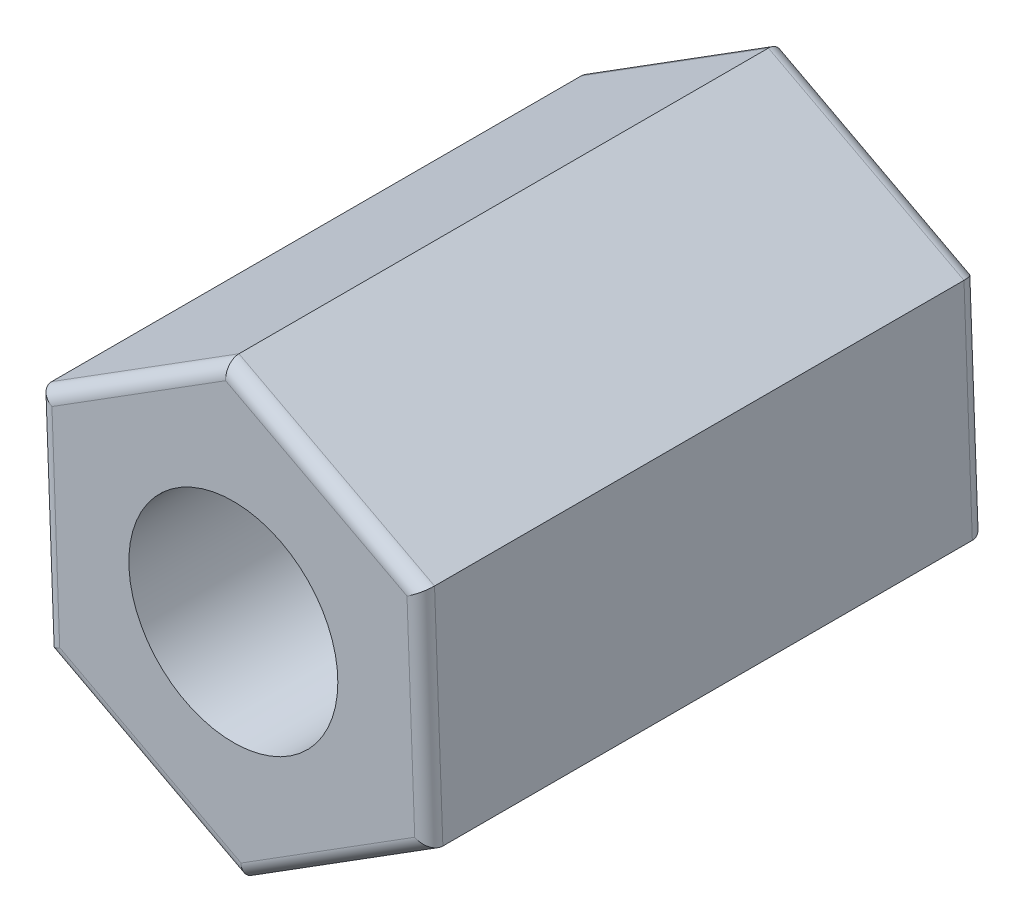
ISO-10303-21;
HEADER;
FILE_DESCRIPTION(('STEP AP214'),'2;1');
FILE_NAME('part.step','',(''),(''),'','','');
FILE_SCHEMA(('AUTOMOTIVE_DESIGN { 1 0 10303 214 1 1 1 1 }'));
ENDSEC;
DATA;
#1=APPLICATION_CONTEXT('core data for automotive mechanical design processes');
#2=APPLICATION_PROTOCOL_DEFINITION('international standard','automotive_design',2000,#1);
#3=PRODUCT_CONTEXT('',#1,'mechanical');
#4=PRODUCT('Part','Part','',(#3));
#5=PRODUCT_RELATED_PRODUCT_CATEGORY('part','',(#4));
#6=PRODUCT_DEFINITION_FORMATION('','',#4);
#7=PRODUCT_DEFINITION_CONTEXT('part definition',#1,'design');
#8=PRODUCT_DEFINITION('design','',#6,#7);
#9=PRODUCT_DEFINITION_SHAPE('','',#8);
#10=(LENGTH_UNIT() NAMED_UNIT(*) SI_UNIT(.MILLI.,.METRE.));
#11=(NAMED_UNIT(*) PLANE_ANGLE_UNIT() SI_UNIT($,.RADIAN.));
#12=(NAMED_UNIT(*) SI_UNIT($,.STERADIAN.) SOLID_ANGLE_UNIT());
#13=UNCERTAINTY_MEASURE_WITH_UNIT(LENGTH_MEASURE(1.E-05),#10,'distance_accuracy_value','');
#14=(GEOMETRIC_REPRESENTATION_CONTEXT(3) GLOBAL_UNCERTAINTY_ASSIGNED_CONTEXT((#13)) GLOBAL_UNIT_ASSIGNED_CONTEXT((#10,
#11,#12)) REPRESENTATION_CONTEXT('',''));
#15=CARTESIAN_POINT('',(0.,0.,0.));
#16=DIRECTION('',(0.,0.,1.));
#17=DIRECTION('',(1.,0.,0.));
#18=AXIS2_PLACEMENT_3D('',#15,#16,#17);
#19=CARTESIAN_POINT('',(1.19089394216838,2.25483294691794,7.8));
#20=DIRECTION('',(0.884248214477624,-0.467017232222896,0.));
#21=DIRECTION('',(0.467017232222896,0.884248214477624,0.));
#22=AXIS2_PLACEMENT_3D('',#19,#20,#21);
#23=CYLINDRICAL_SURFACE('',#22,0.2);
#24=CARTESIAN_POINT('',(-0.110934466712332,2.94239588500515,7.8));
#25=DIRECTION('',(0.999290033100101,0.0376753201286878,0.));
#26=DIRECTION('',(-0.0376753201286876,0.999290033100101,0.));
#27=AXIS2_PLACEMENT_3D('',#24,#25,#26);
#28=ELLIPSE('',#27,0.23094010767585,0.2);
#29=CARTESIAN_POINT('',(-0.110934466712331,2.94239588500515,8.));
#30=VERTEX_POINT('',#29);
#31=CARTESIAN_POINT('',(-0.119635209199572,3.17317203284869,7.8));
#32=VERTEX_POINT('',#31);
#33=EDGE_CURVE('E11',#30,#32,#28,.F.);
#34=ORIENTED_EDGE('',*,*,#33,.F.);
#35=DIRECTION('',(-0.884248214477624,0.467017232222896,0.));
#36=VECTOR('',#35,1.);
#37=CARTESIAN_POINT('',(1.19089394216838,2.25483294691794,8.));
#38=LINE('',#37,#36);
#39=CARTESIAN_POINT('',(2.4927223510491,1.56727000883072,8.));
#40=VERTEX_POINT('',#39);
#41=EDGE_CURVE('E191',#40,#30,#38,.T.);
#42=ORIENTED_EDGE('',*,*,#41,.F.);
#43=CARTESIAN_POINT('',(2.4927223510491,1.56727000883072,7.8));
#44=DIRECTION('',(0.532272800877204,-0.846572894348937,0.));
#45=DIRECTION('',(0.846572894348937,0.532272800877205,0.));
#46=AXIS2_PLACEMENT_3D('',#43,#44,#45);
#47=ELLIPSE('',#46,0.23094010767585,0.2);
#48=CARTESIAN_POINT('',(2.6882299864255,1.69019314677823,7.8));
#49=VERTEX_POINT('',#48);
#50=EDGE_CURVE('E41',#40,#49,#47,.F.);
#51=ORIENTED_EDGE('',*,*,#50,.T.);
#52=DIRECTION('',(-0.884248214477624,0.467017232222896,0.));
#53=VECTOR('',#52,1.);
#54=CARTESIAN_POINT('',(1.28429738861296,2.43168258981346,7.8));
#55=LINE('',#54,#53);
#56=EDGE_CURVE('E223',#32,#49,#55,.F.);
#57=ORIENTED_EDGE('',*,*,#56,.F.);
#58=EDGE_LOOP('',(#34,#42,#51,#57));
#59=FACE_BOUND('',#58,.T.);
#60=ADVANCED_FACE('F34',(#59),#23,.T.);
#61=CARTESIAN_POINT('',(2.54818958440526,0.0960720663281503,7.8));
#62=DIRECTION('',(0.0376753201286864,-0.999290033100101,0.));
#63=DIRECTION('',(0.999290033100101,0.0376753201286864,0.));
#64=AXIS2_PLACEMENT_3D('',#61,#62,#63);
#65=CYLINDRICAL_SURFACE('',#64,0.2);
#66=ORIENTED_EDGE('',*,*,#50,.F.);
#67=DIRECTION('',(-0.0376753201286864,0.999290033100101,0.));
#68=VECTOR('',#67,1.);
#69=CARTESIAN_POINT('',(2.54818958440526,0.0960720663281503,8.));
#70=LINE('',#69,#68);
#71=CARTESIAN_POINT('',(2.60365681776142,-1.37512587617442,8.));
#72=VERTEX_POINT('',#71);
#73=EDGE_CURVE('E194',#72,#40,#70,.T.);
#74=ORIENTED_EDGE('',*,*,#73,.F.);
#75=CARTESIAN_POINT('',(2.60365681776142,-1.37512587617442,7.8));
#76=DIRECTION('',(-0.467017232222896,-0.884248214477624,0.));
#77=DIRECTION('',(0.884248214477624,-0.467017232222896,0.));
#78=AXIS2_PLACEMENT_3D('',#75,#76,#77);
#79=ELLIPSE('',#78,0.23094010767585,0.2);
#80=CARTESIAN_POINT('',(2.80786519562506,-1.48297888607045,7.8));
#81=VERTEX_POINT('',#80);
#82=EDGE_CURVE('E55',#72,#81,#79,.F.);
#83=ORIENTED_EDGE('',*,*,#82,.T.);
#84=DIRECTION('',(-0.0376753201286864,0.999290033100101,0.));
#85=VECTOR('',#84,1.);
#86=CARTESIAN_POINT('',(2.74804759102528,0.103607130353888,7.8));
#87=LINE('',#86,#85);
#88=EDGE_CURVE('E221',#49,#81,#87,.F.);
#89=ORIENTED_EDGE('',*,*,#88,.F.);
#90=EDGE_LOOP('',(#66,#74,#83,#89));
#91=FACE_BOUND('',#90,.T.);
#92=ADVANCED_FACE('F282',(#91),#65,.T.);
#93=CARTESIAN_POINT('',(1.35729564223687,-2.15876088058979,7.8));
#94=DIRECTION('',(-0.846572894348936,-0.532272800877206,0.));
#95=DIRECTION('',(0.532272800877206,-0.846572894348936,0.));
#96=AXIS2_PLACEMENT_3D('',#93,#94,#95);
#97=CYLINDRICAL_SURFACE('',#96,0.2);
#98=ORIENTED_EDGE('',*,*,#82,.F.);
#99=DIRECTION('',(0.846572894348936,0.532272800877206,0.));
#100=VECTOR('',#99,1.);
#101=CARTESIAN_POINT('',(1.35729564223687,-2.15876088058979,8.));
#102=LINE('',#101,#100);
#103=CARTESIAN_POINT('',(0.110934466712327,-2.94239588500515,8.));
#104=VERTEX_POINT('',#103);
#105=EDGE_CURVE('E197',#104,#72,#102,.T.);
#106=ORIENTED_EDGE('',*,*,#105,.F.);
#107=CARTESIAN_POINT('',(0.110934466712327,-2.94239588500515,7.8));
#108=DIRECTION('',(-0.999290033100101,-0.0376753201286868,0.));
#109=DIRECTION('',(0.0376753201286868,-0.999290033100101,0.));
#110=AXIS2_PLACEMENT_3D('',#107,#108,#109);
#111=ELLIPSE('',#110,0.23094010767585,0.2);
#112=CARTESIAN_POINT('',(0.119635209199567,-3.17317203284869,7.8));
#113=VERTEX_POINT('',#112);
#114=EDGE_CURVE('E229',#104,#113,#111,.F.);
#115=ORIENTED_EDGE('',*,*,#114,.T.);
#116=DIRECTION('',(0.846572894348936,0.532272800877206,0.));
#117=VECTOR('',#116,1.);
#118=CARTESIAN_POINT('',(1.46375020241231,-2.32807545945957,7.8));
#119=LINE('',#118,#117);
#120=EDGE_CURVE('E218',#81,#113,#119,.F.);
#121=ORIENTED_EDGE('',*,*,#120,.F.);
#122=EDGE_LOOP('',(#98,#106,#115,#121));
#123=FACE_BOUND('',#122,.T.);
#124=ADVANCED_FACE('F234',(#123),#97,.T.);
#125=CARTESIAN_POINT('',(-1.19089394216839,-2.25483294691794,7.8));
#126=DIRECTION('',(-0.884248214477623,0.467017232222898,0.));
#127=DIRECTION('',(-0.467017232222898,-0.884248214477623,0.));
#128=AXIS2_PLACEMENT_3D('',#125,#126,#127);
#129=CYLINDRICAL_SURFACE('',#128,0.2);
#130=ORIENTED_EDGE('',*,*,#114,.F.);
#131=DIRECTION('',(0.884248214477623,-0.467017232222898,0.));
#132=VECTOR('',#131,1.);
#133=CARTESIAN_POINT('',(-1.19089394216839,-2.25483294691794,8.));
#134=LINE('',#133,#132);
#135=CARTESIAN_POINT('',(-2.49272235104909,-1.56727000883072,8.));
#136=VERTEX_POINT('',#135);
#137=EDGE_CURVE('E200',#136,#104,#134,.T.);
#138=ORIENTED_EDGE('',*,*,#137,.F.);
#139=CARTESIAN_POINT('',(-2.49272235104909,-1.56727000883072,7.8));
#140=DIRECTION('',(-0.532272800877204,0.846572894348937,0.));
#141=DIRECTION('',(-0.846572894348937,-0.532272800877204,0.));
#142=AXIS2_PLACEMENT_3D('',#139,#140,#141);
#143=ELLIPSE('',#142,0.23094010767585,0.2);
#144=CARTESIAN_POINT('',(-2.68822998642549,-1.69019314677823,7.8));
#145=VERTEX_POINT('',#144);
#146=EDGE_CURVE('E227',#136,#145,#143,.F.);
#147=ORIENTED_EDGE('',*,*,#146,.T.);
#148=DIRECTION('',(0.884248214477623,-0.467017232222898,0.));
#149=VECTOR('',#148,1.);
#150=CARTESIAN_POINT('',(-1.28429738861297,-2.43168258981346,7.8));
#151=LINE('',#150,#149);
#152=EDGE_CURVE('E215',#113,#145,#151,.F.);
#153=ORIENTED_EDGE('',*,*,#152,.F.);
#154=EDGE_LOOP('',(#130,#138,#147,#153));
#155=FACE_BOUND('',#154,.T.);
#156=ADVANCED_FACE('F244',(#155),#129,.T.);
#157=CARTESIAN_POINT('',(-2.54818958440525,-0.0960720663281535,7.8));
#158=DIRECTION('',(-0.0376753201286877,0.999290033100101,0.));
#159=DIRECTION('',(-0.999290033100101,-0.0376753201286877,0.));
#160=AXIS2_PLACEMENT_3D('',#157,#158,#159);
#161=CYLINDRICAL_SURFACE('',#160,0.2);
#162=ORIENTED_EDGE('',*,*,#146,.F.);
#163=DIRECTION('',(0.0376753201286877,-0.999290033100101,0.));
#164=VECTOR('',#163,1.);
#165=CARTESIAN_POINT('',(-2.54818958440525,-0.0960720663281535,8.));
#166=LINE('',#165,#164);
#167=CARTESIAN_POINT('',(-2.60365681776142,1.37512587617442,8.));
#168=VERTEX_POINT('',#167);
#169=EDGE_CURVE('E203',#168,#136,#166,.T.);
#170=ORIENTED_EDGE('',*,*,#169,.F.);
#171=CARTESIAN_POINT('',(-2.60365681776142,1.37512587617442,7.8));
#172=DIRECTION('',(0.467017232222896,0.884248214477624,0.));
#173=DIRECTION('',(-0.884248214477624,0.467017232222895,0.));
#174=AXIS2_PLACEMENT_3D('',#171,#172,#173);
#175=ELLIPSE('',#174,0.23094010767585,0.2);
#176=CARTESIAN_POINT('',(-2.80786519562506,1.48297888607046,7.8));
#177=VERTEX_POINT('',#176);
#178=EDGE_CURVE('E225',#168,#177,#175,.F.);
#179=ORIENTED_EDGE('',*,*,#178,.T.);
#180=DIRECTION('',(0.0376753201286877,-0.999290033100101,0.));
#181=VECTOR('',#180,1.);
#182=CARTESIAN_POINT('',(-2.74804759102527,-0.103607130353891,7.8));
#183=LINE('',#182,#181);
#184=EDGE_CURVE('E212',#145,#177,#183,.F.);
#185=ORIENTED_EDGE('',*,*,#184,.F.);
#186=EDGE_LOOP('',(#162,#170,#179,#185));
#187=FACE_BOUND('',#186,.T.);
#188=ADVANCED_FACE('F311',(#187),#161,.T.);
#189=CARTESIAN_POINT('',(-1.35729564223687,2.15876088058979,7.8));
#190=DIRECTION('',(0.846572894348936,0.532272800877206,0.));
#191=DIRECTION('',(-0.532272800877206,0.846572894348936,0.));
#192=AXIS2_PLACEMENT_3D('',#189,#190,#191);
#193=CYLINDRICAL_SURFACE('',#192,0.2);
#194=DIRECTION('',(-0.846572894348936,-0.532272800877206,0.));
#195=VECTOR('',#194,1.);
#196=CARTESIAN_POINT('',(-1.35729564223687,2.15876088058979,8.));
#197=LINE('',#196,#195);
#198=EDGE_CURVE('E206',#30,#168,#197,.T.);
#199=ORIENTED_EDGE('',*,*,#198,.F.);
#200=ORIENTED_EDGE('',*,*,#33,.T.);
#201=DIRECTION('',(-0.846572894348936,-0.532272800877206,0.));
#202=VECTOR('',#201,1.);
#203=CARTESIAN_POINT('',(-1.46375020241232,2.32807545945957,7.8));
#204=LINE('',#203,#202);
#205=EDGE_CURVE('E209',#177,#32,#204,.F.);
#206=ORIENTED_EDGE('',*,*,#205,.F.);
#207=ORIENTED_EDGE('',*,*,#178,.F.);
#208=EDGE_LOOP('',(#199,#200,#206,#207));
#209=FACE_BOUND('',#208,.T.);
#210=ADVANCED_FACE('F289',(#209),#193,.T.);
#211=CARTESIAN_POINT('',(-2.54818958440525,-0.0960720663281535,0.2));
#212=DIRECTION('',(-0.0376753201286877,0.999290033100101,0.));
#213=DIRECTION('',(-0.999290033100101,-0.0376753201286877,0.));
#214=AXIS2_PLACEMENT_3D('',#211,#212,#213);
#215=CYLINDRICAL_SURFACE('',#214,0.2);
#216=CARTESIAN_POINT('',(-2.60365681776142,1.37512587617442,0.2));
#217=DIRECTION('',(0.467017232222896,0.884248214477624,0.));
#218=DIRECTION('',(0.884248214477624,-0.467017232222895,0.));
#219=AXIS2_PLACEMENT_3D('',#216,#217,#218);
#220=ELLIPSE('',#219,0.23094010767585,0.2);
#221=CARTESIAN_POINT('',(-2.60365681776142,1.37512587617442,0.));
#222=VERTEX_POINT('',#221);
#223=CARTESIAN_POINT('',(-2.80786519562506,1.48297888607046,0.200000000000001));
#224=VERTEX_POINT('',#223);
#225=EDGE_CURVE('E134',#222,#224,#220,.T.);
#226=ORIENTED_EDGE('',*,*,#225,.F.);
#227=DIRECTION('',(-0.0376753201286877,0.999290033100101,0.));
#228=VECTOR('',#227,1.);
#229=CARTESIAN_POINT('',(-2.54818958440525,-0.0960720663281535,0.));
#230=LINE('',#229,#228);
#231=CARTESIAN_POINT('',(-2.49272235104909,-1.56727000883072,0.));
#232=VERTEX_POINT('',#231);
#233=EDGE_CURVE('E143',#232,#222,#230,.T.);
#234=ORIENTED_EDGE('',*,*,#233,.F.);
#235=CARTESIAN_POINT('',(-2.49272235104909,-1.56727000883072,0.2));
#236=DIRECTION('',(-0.532272800877204,0.846572894348937,0.));
#237=DIRECTION('',(0.846572894348937,0.532272800877204,0.));
#238=AXIS2_PLACEMENT_3D('',#235,#236,#237);
#239=ELLIPSE('',#238,0.23094010767585,0.2);
#240=CARTESIAN_POINT('',(-2.68822998642549,-1.69019314677823,0.200000000000001));
#241=VERTEX_POINT('',#240);
#242=EDGE_CURVE('E123',#232,#241,#239,.T.);
#243=ORIENTED_EDGE('',*,*,#242,.T.);
#244=DIRECTION('',(-0.0376753201286877,0.999290033100101,0.));
#245=VECTOR('',#244,1.);
#246=CARTESIAN_POINT('',(-2.80786519562506,1.48297888607046,0.2));
#247=LINE('',#246,#245);
#248=EDGE_CURVE('E178',#224,#241,#247,.F.);
#249=ORIENTED_EDGE('',*,*,#248,.F.);
#250=EDGE_LOOP('',(#226,#234,#243,#249));
#251=FACE_BOUND('',#250,.T.);
#252=ADVANCED_FACE('F148',(#251),#215,.T.);
#253=CARTESIAN_POINT('',(-1.19089394216839,-2.25483294691794,0.2));
#254=DIRECTION('',(-0.884248214477623,0.467017232222898,0.));
#255=DIRECTION('',(-0.467017232222898,-0.884248214477623,0.));
#256=AXIS2_PLACEMENT_3D('',#253,#254,#255);
#257=CYLINDRICAL_SURFACE('',#256,0.2);
#258=ORIENTED_EDGE('',*,*,#242,.F.);
#259=DIRECTION('',(-0.884248214477623,0.467017232222898,0.));
#260=VECTOR('',#259,1.);
#261=CARTESIAN_POINT('',(-1.19089394216839,-2.25483294691794,0.));
#262=LINE('',#261,#260);
#263=CARTESIAN_POINT('',(0.110934466712326,-2.94239588500515,0.));
#264=VERTEX_POINT('',#263);
#265=EDGE_CURVE('E127',#264,#232,#262,.T.);
#266=ORIENTED_EDGE('',*,*,#265,.F.);
#267=CARTESIAN_POINT('',(0.110934466712326,-2.94239588500515,0.2));
#268=DIRECTION('',(-0.999290033100101,-0.0376753201286868,0.));
#269=DIRECTION('',(-0.0376753201286868,0.999290033100101,0.));
#270=AXIS2_PLACEMENT_3D('',#267,#268,#269);
#271=ELLIPSE('',#270,0.23094010767585,0.2);
#272=CARTESIAN_POINT('',(0.119635209199567,-3.17317203284869,0.200000000000001));
#273=VERTEX_POINT('',#272);
#274=EDGE_CURVE('E135',#264,#273,#271,.T.);
#275=ORIENTED_EDGE('',*,*,#274,.T.);
#276=DIRECTION('',(-0.884248214477623,0.467017232222898,0.));
#277=VECTOR('',#276,1.);
#278=CARTESIAN_POINT('',(-2.68822998642549,-1.69019314677823,0.2));
#279=LINE('',#278,#277);
#280=EDGE_CURVE('E129',#241,#273,#279,.F.);
#281=ORIENTED_EDGE('',*,*,#280,.F.);
#282=EDGE_LOOP('',(#258,#266,#275,#281));
#283=FACE_BOUND('',#282,.T.);
#284=ADVANCED_FACE('F125',(#283),#257,.T.);
#285=CARTESIAN_POINT('',(1.35729564223687,-2.15876088058979,0.2));
#286=DIRECTION('',(-0.846572894348936,-0.532272800877206,0.));
#287=DIRECTION('',(0.532272800877206,-0.846572894348936,0.));
#288=AXIS2_PLACEMENT_3D('',#285,#286,#287);
#289=CYLINDRICAL_SURFACE('',#288,0.2);
#290=ORIENTED_EDGE('',*,*,#274,.F.);
#291=DIRECTION('',(-0.846572894348936,-0.532272800877206,0.));
#292=VECTOR('',#291,1.);
#293=CARTESIAN_POINT('',(1.35729564223687,-2.15876088058979,0.));
#294=LINE('',#293,#292);
#295=CARTESIAN_POINT('',(2.60365681776142,-1.37512587617442,0.));
#296=VERTEX_POINT('',#295);
#297=EDGE_CURVE('E146',#296,#264,#294,.T.);
#298=ORIENTED_EDGE('',*,*,#297,.F.);
#299=CARTESIAN_POINT('',(2.60365681776142,-1.37512587617442,0.2));
#300=DIRECTION('',(-0.467017232222896,-0.884248214477624,0.));
#301=DIRECTION('',(-0.884248214477624,0.467017232222896,0.));
#302=AXIS2_PLACEMENT_3D('',#299,#300,#301);
#303=ELLIPSE('',#302,0.23094010767585,0.2);
#304=CARTESIAN_POINT('',(2.80786519562506,-1.48297888607045,0.200000000000001));
#305=VERTEX_POINT('',#304);
#306=EDGE_CURVE('E186',#296,#305,#303,.T.);
#307=ORIENTED_EDGE('',*,*,#306,.T.);
#308=DIRECTION('',(-0.846572894348936,-0.532272800877206,0.));
#309=VECTOR('',#308,1.);
#310=CARTESIAN_POINT('',(0.119635209199567,-3.17317203284869,0.2));
#311=LINE('',#310,#309);
#312=EDGE_CURVE('E174',#273,#305,#311,.F.);
#313=ORIENTED_EDGE('',*,*,#312,.F.);
#314=EDGE_LOOP('',(#290,#298,#307,#313));
#315=FACE_BOUND('',#314,.T.);
#316=ADVANCED_FACE('F417',(#315),#289,.T.);
#317=CARTESIAN_POINT('',(2.54818958440526,0.0960720663281503,0.2));
#318=DIRECTION('',(0.0376753201286864,-0.999290033100101,0.));
#319=DIRECTION('',(0.999290033100101,0.0376753201286864,0.));
#320=AXIS2_PLACEMENT_3D('',#317,#318,#319);
#321=CYLINDRICAL_SURFACE('',#320,0.2);
#322=ORIENTED_EDGE('',*,*,#306,.F.);
#323=DIRECTION('',(0.0376753201286864,-0.999290033100101,0.));
#324=VECTOR('',#323,1.);
#325=CARTESIAN_POINT('',(2.54818958440526,0.0960720663281503,0.));
#326=LINE('',#325,#324);
#327=CARTESIAN_POINT('',(2.4927223510491,1.56727000883072,0.));
#328=VERTEX_POINT('',#327);
#329=EDGE_CURVE('E158',#328,#296,#326,.T.);
#330=ORIENTED_EDGE('',*,*,#329,.F.);
#331=CARTESIAN_POINT('',(2.4927223510491,1.56727000883072,0.2));
#332=DIRECTION('',(0.532272800877204,-0.846572894348937,0.));
#333=DIRECTION('',(-0.846572894348937,-0.532272800877205,0.));
#334=AXIS2_PLACEMENT_3D('',#331,#332,#333);
#335=ELLIPSE('',#334,0.23094010767585,0.2);
#336=CARTESIAN_POINT('',(2.6882299864255,1.69019314677823,0.200000000000001));
#337=VERTEX_POINT('',#336);
#338=EDGE_CURVE('E183',#328,#337,#335,.T.);
#339=ORIENTED_EDGE('',*,*,#338,.T.);
#340=DIRECTION('',(0.0376753201286864,-0.999290033100101,0.));
#341=VECTOR('',#340,1.);
#342=CARTESIAN_POINT('',(2.80786519562506,-1.48297888607045,0.2));
#343=LINE('',#342,#341);
#344=EDGE_CURVE('E171',#305,#337,#343,.F.);
#345=ORIENTED_EDGE('',*,*,#344,.F.);
#346=EDGE_LOOP('',(#322,#330,#339,#345));
#347=FACE_BOUND('',#346,.T.);
#348=ADVANCED_FACE('F302',(#347),#321,.T.);
#349=CARTESIAN_POINT('',(1.19089394216838,2.25483294691794,0.2));
#350=DIRECTION('',(0.884248214477624,-0.467017232222896,0.));
#351=DIRECTION('',(0.467017232222896,0.884248214477624,0.));
#352=AXIS2_PLACEMENT_3D('',#349,#350,#351);
#353=CYLINDRICAL_SURFACE('',#352,0.2);
#354=ORIENTED_EDGE('',*,*,#338,.F.);
#355=DIRECTION('',(0.884248214477624,-0.467017232222896,0.));
#356=VECTOR('',#355,1.);
#357=CARTESIAN_POINT('',(1.19089394216838,2.25483294691794,0.));
#358=LINE('',#357,#356);
#359=CARTESIAN_POINT('',(-0.110934466712331,2.94239588500515,0.));
#360=VERTEX_POINT('',#359);
#361=EDGE_CURVE('E160',#360,#328,#358,.T.);
#362=ORIENTED_EDGE('',*,*,#361,.F.);
#363=CARTESIAN_POINT('',(-0.11093446671233,2.94239588500515,0.2));
#364=DIRECTION('',(0.999290033100101,0.0376753201286878,0.));
#365=DIRECTION('',(0.0376753201286876,-0.999290033100101,0.));
#366=AXIS2_PLACEMENT_3D('',#363,#364,#365);
#367=ELLIPSE('',#366,0.23094010767585,0.2);
#368=CARTESIAN_POINT('',(-0.119635209199572,3.17317203284869,0.200000000000001));
#369=VERTEX_POINT('',#368);
#370=EDGE_CURVE('E180',#360,#369,#367,.T.);
#371=ORIENTED_EDGE('',*,*,#370,.T.);
#372=DIRECTION('',(0.884248214477624,-0.467017232222896,0.));
#373=VECTOR('',#372,1.);
#374=CARTESIAN_POINT('',(2.6882299864255,1.69019314677823,0.2));
#375=LINE('',#374,#373);
#376=EDGE_CURVE('E168',#337,#369,#375,.F.);
#377=ORIENTED_EDGE('',*,*,#376,.F.);
#378=EDGE_LOOP('',(#354,#362,#371,#377));
#379=FACE_BOUND('',#378,.T.);
#380=ADVANCED_FACE('F277',(#379),#353,.T.);
#381=CARTESIAN_POINT('',(-1.35729564223687,2.15876088058979,0.2));
#382=DIRECTION('',(0.846572894348936,0.532272800877206,0.));
#383=DIRECTION('',(-0.532272800877206,0.846572894348936,0.));
#384=AXIS2_PLACEMENT_3D('',#381,#382,#383);
#385=CYLINDRICAL_SURFACE('',#384,0.2);
#386=DIRECTION('',(0.846572894348936,0.532272800877206,0.));
#387=VECTOR('',#386,1.);
#388=CARTESIAN_POINT('',(-1.35729564223687,2.15876088058979,0.));
#389=LINE('',#388,#387);
#390=EDGE_CURVE('E163',#222,#360,#389,.T.);
#391=ORIENTED_EDGE('',*,*,#390,.F.);
#392=ORIENTED_EDGE('',*,*,#225,.T.);
#393=DIRECTION('',(0.846572894348936,0.532272800877206,0.));
#394=VECTOR('',#393,1.);
#395=CARTESIAN_POINT('',(-0.119635209199572,3.17317203284869,0.2));
#396=LINE('',#395,#394);
#397=EDGE_CURVE('E165',#369,#224,#396,.F.);
#398=ORIENTED_EDGE('',*,*,#397,.F.);
#399=ORIENTED_EDGE('',*,*,#370,.F.);
#400=EDGE_LOOP('',(#391,#392,#398,#399));
#401=FACE_BOUND('',#400,.T.);
#402=ADVANCED_FACE('F268',(#401),#385,.T.);
#403=CARTESIAN_POINT('',(0.,0.,8.));
#404=DIRECTION('',(0.,0.,1.));
#405=DIRECTION('',(1.,0.,0.));
#406=AXIS2_PLACEMENT_3D('',#403,#404,#405);
#407=PLANE('',#406);
#408=ORIENTED_EDGE('',*,*,#41,.T.);
#409=ORIENTED_EDGE('',*,*,#198,.T.);
#410=ORIENTED_EDGE('',*,*,#169,.T.);
#411=ORIENTED_EDGE('',*,*,#137,.T.);
#412=ORIENTED_EDGE('',*,*,#105,.T.);
#413=ORIENTED_EDGE('',*,*,#73,.T.);
#414=EDGE_LOOP('',(#408,#409,#410,#411,#412,#413));
#415=FACE_BOUND('',#414,.T.);
#416=CARTESIAN_POINT('',(0.,0.,8.));
#417=DIRECTION('',(0.,0.,1.));
#418=DIRECTION('',(1.,0.,0.));
#419=AXIS2_PLACEMENT_3D('',#416,#417,#418);
#420=CIRCLE('',#419,1.5);
#421=CARTESIAN_POINT('',(1.5,0.,8.));
#422=VERTEX_POINT('',#421);
#423=EDGE_CURVE('E256',#422,#422,#420,.T.);
#424=ORIENTED_EDGE('',*,*,#423,.F.);
#425=EDGE_LOOP('',(#424));
#426=FACE_BOUND('',#425,.T.);
#427=ADVANCED_FACE('F266',(#415,#426),#407,.T.);
#428=CARTESIAN_POINT('',(0.,0.,0.));
#429=DIRECTION('',(0.,0.,1.));
#430=DIRECTION('',(1.,0.,0.));
#431=AXIS2_PLACEMENT_3D('',#428,#429,#430);
#432=PLANE('',#431);
#433=ORIENTED_EDGE('',*,*,#233,.T.);
#434=ORIENTED_EDGE('',*,*,#390,.T.);
#435=ORIENTED_EDGE('',*,*,#361,.T.);
#436=ORIENTED_EDGE('',*,*,#329,.T.);
#437=ORIENTED_EDGE('',*,*,#297,.T.);
#438=ORIENTED_EDGE('',*,*,#265,.T.);
#439=EDGE_LOOP('',(#433,#434,#435,#436,#437,#438));
#440=FACE_BOUND('',#439,.T.);
#441=CARTESIAN_POINT('',(0.,0.,0.));
#442=DIRECTION('',(0.,0.,1.));
#443=DIRECTION('',(1.,0.,0.));
#444=AXIS2_PLACEMENT_3D('',#441,#442,#443);
#445=CIRCLE('',#444,1.5);
#446=CARTESIAN_POINT('',(1.5,0.,0.));
#447=VERTEX_POINT('',#446);
#448=EDGE_CURVE('E257',#447,#447,#445,.T.);
#449=ORIENTED_EDGE('',*,*,#448,.T.);
#450=EDGE_LOOP('',(#449));
#451=FACE_BOUND('',#450,.T.);
#452=ADVANCED_FACE('F140',(#440,#451),#432,.F.);
#453=CARTESIAN_POINT('',(-0.119635209199572,3.17317203284869,8.));
#454=DIRECTION('',(0.532272800877206,-0.846572894348936,0.));
#455=DIRECTION('',(0.846572894348936,0.532272800877206,0.));
#456=AXIS2_PLACEMENT_3D('',#453,#454,#455);
#457=PLANE('',#456);
#458=DIRECTION('',(0.,0.,-1.));
#459=VECTOR('',#458,1.);
#460=CARTESIAN_POINT('',(-2.80786519562506,1.48297888607046,8.));
#461=LINE('',#460,#459);
#462=EDGE_CURVE('E151',#177,#224,#461,.T.);
#463=ORIENTED_EDGE('',*,*,#462,.F.);
#464=ORIENTED_EDGE('',*,*,#205,.T.);
#465=DIRECTION('',(0.,0.,-1.));
#466=VECTOR('',#465,1.);
#467=CARTESIAN_POINT('',(-0.119635209199572,3.17317203284869,8.));
#468=LINE('',#467,#466);
#469=EDGE_CURVE('E254',#32,#369,#468,.T.);
#470=ORIENTED_EDGE('',*,*,#469,.T.);
#471=ORIENTED_EDGE('',*,*,#397,.T.);
#472=EDGE_LOOP('',(#463,#464,#470,#471));
#473=FACE_BOUND('',#472,.T.);
#474=ADVANCED_FACE('F275',(#473),#457,.F.);
#475=CARTESIAN_POINT('',(-2.80786519562506,1.48297888607046,8.));
#476=DIRECTION('',(0.999290033100101,0.0376753201286877,0.));
#477=DIRECTION('',(-0.0376753201286877,0.999290033100101,0.));
#478=AXIS2_PLACEMENT_3D('',#475,#476,#477);
#479=PLANE('',#478);
#480=DIRECTION('',(0.,0.,-1.));
#481=VECTOR('',#480,1.);
#482=CARTESIAN_POINT('',(-2.68822998642549,-1.69019314677823,8.));
#483=LINE('',#482,#481);
#484=EDGE_CURVE('E153',#145,#241,#483,.T.);
#485=ORIENTED_EDGE('',*,*,#484,.F.);
#486=ORIENTED_EDGE('',*,*,#184,.T.);
#487=ORIENTED_EDGE('',*,*,#462,.T.);
#488=ORIENTED_EDGE('',*,*,#248,.T.);
#489=EDGE_LOOP('',(#485,#486,#487,#488));
#490=FACE_BOUND('',#489,.T.);
#491=ADVANCED_FACE('F309',(#490),#479,.F.);
#492=CARTESIAN_POINT('',(-2.68822998642549,-1.69019314677823,8.));
#493=DIRECTION('',(0.467017232222898,0.884248214477623,0.));
#494=DIRECTION('',(-0.884248214477623,0.467017232222898,0.));
#495=AXIS2_PLACEMENT_3D('',#492,#493,#494);
#496=PLANE('',#495);
#497=DIRECTION('',(0.,0.,-1.));
#498=VECTOR('',#497,1.);
#499=CARTESIAN_POINT('',(0.119635209199567,-3.17317203284869,8.));
#500=LINE('',#499,#498);
#501=EDGE_CURVE('E242',#113,#273,#500,.T.);
#502=ORIENTED_EDGE('',*,*,#501,.F.);
#503=ORIENTED_EDGE('',*,*,#152,.T.);
#504=ORIENTED_EDGE('',*,*,#484,.T.);
#505=ORIENTED_EDGE('',*,*,#280,.T.);
#506=EDGE_LOOP('',(#502,#503,#504,#505));
#507=FACE_BOUND('',#506,.T.);
#508=ADVANCED_FACE('F247',(#507),#496,.F.);
#509=CARTESIAN_POINT('',(0.119635209199567,-3.17317203284869,8.));
#510=DIRECTION('',(-0.532272800877206,0.846572894348936,0.));
#511=DIRECTION('',(-0.846572894348936,-0.532272800877206,0.));
#512=AXIS2_PLACEMENT_3D('',#509,#510,#511);
#513=PLANE('',#512);
#514=DIRECTION('',(0.,0.,-1.));
#515=VECTOR('',#514,1.);
#516=CARTESIAN_POINT('',(2.80786519562506,-1.48297888607045,8.));
#517=LINE('',#516,#515);
#518=EDGE_CURVE('E243',#81,#305,#517,.T.);
#519=ORIENTED_EDGE('',*,*,#518,.F.);
#520=ORIENTED_EDGE('',*,*,#120,.T.);
#521=ORIENTED_EDGE('',*,*,#501,.T.);
#522=ORIENTED_EDGE('',*,*,#312,.T.);
#523=EDGE_LOOP('',(#519,#520,#521,#522));
#524=FACE_BOUND('',#523,.T.);
#525=ADVANCED_FACE('F240',(#524),#513,.F.);
#526=CARTESIAN_POINT('',(2.80786519562506,-1.48297888607045,8.));
#527=DIRECTION('',(-0.999290033100101,-0.0376753201286864,0.));
#528=DIRECTION('',(0.0376753201286864,-0.999290033100101,0.));
#529=AXIS2_PLACEMENT_3D('',#526,#527,#528);
#530=PLANE('',#529);
#531=DIRECTION('',(0.,0.,-1.));
#532=VECTOR('',#531,1.);
#533=CARTESIAN_POINT('',(2.6882299864255,1.69019314677823,8.));
#534=LINE('',#533,#532);
#535=EDGE_CURVE('E250',#49,#337,#534,.T.);
#536=ORIENTED_EDGE('',*,*,#535,.F.);
#537=ORIENTED_EDGE('',*,*,#88,.T.);
#538=ORIENTED_EDGE('',*,*,#518,.T.);
#539=ORIENTED_EDGE('',*,*,#344,.T.);
#540=EDGE_LOOP('',(#536,#537,#538,#539));
#541=FACE_BOUND('',#540,.T.);
#542=ADVANCED_FACE('F293',(#541),#530,.F.);
#543=CARTESIAN_POINT('',(2.6882299864255,1.69019314677823,8.));
#544=DIRECTION('',(-0.467017232222896,-0.884248214477624,0.));
#545=DIRECTION('',(0.884248214477624,-0.467017232222896,0.));
#546=AXIS2_PLACEMENT_3D('',#543,#544,#545);
#547=PLANE('',#546);
#548=ORIENTED_EDGE('',*,*,#469,.F.);
#549=ORIENTED_EDGE('',*,*,#56,.T.);
#550=ORIENTED_EDGE('',*,*,#535,.T.);
#551=ORIENTED_EDGE('',*,*,#376,.T.);
#552=EDGE_LOOP('',(#548,#549,#550,#551));
#553=FACE_BOUND('',#552,.T.);
#554=ADVANCED_FACE('F298',(#553),#547,.F.);
#555=CARTESIAN_POINT('',(0.,0.,8.));
#556=DIRECTION('',(0.,0.,-1.));
#557=DIRECTION('',(-1.,0.,0.));
#558=AXIS2_PLACEMENT_3D('',#555,#556,#557);
#559=CYLINDRICAL_SURFACE('',#558,1.5);
#560=ORIENTED_EDGE('',*,*,#423,.T.);
#561=EDGE_LOOP('',(#560));
#562=FACE_BOUND('',#561,.T.);
#563=ORIENTED_EDGE('',*,*,#448,.F.);
#564=EDGE_LOOP('',(#563));
#565=FACE_BOUND('',#564,.T.);
#566=ADVANCED_FACE('F263',(#562,#565),#559,.F.);
#567=CLOSED_SHELL('',(#60,#92,#124,#156,#188,#210,#252,#284,#316,#348,#380,#402,#427,#452,#474,
#491,#508,#525,#542,#554,#566));
#568=MANIFOLD_SOLID_BREP('B2',#567);
#569=ADVANCED_BREP_SHAPE_REPRESENTATION('',(#18,#568),#14);
#570=SHAPE_DEFINITION_REPRESENTATION(#9,#569);
ENDSEC;
END-ISO-10303-21;
